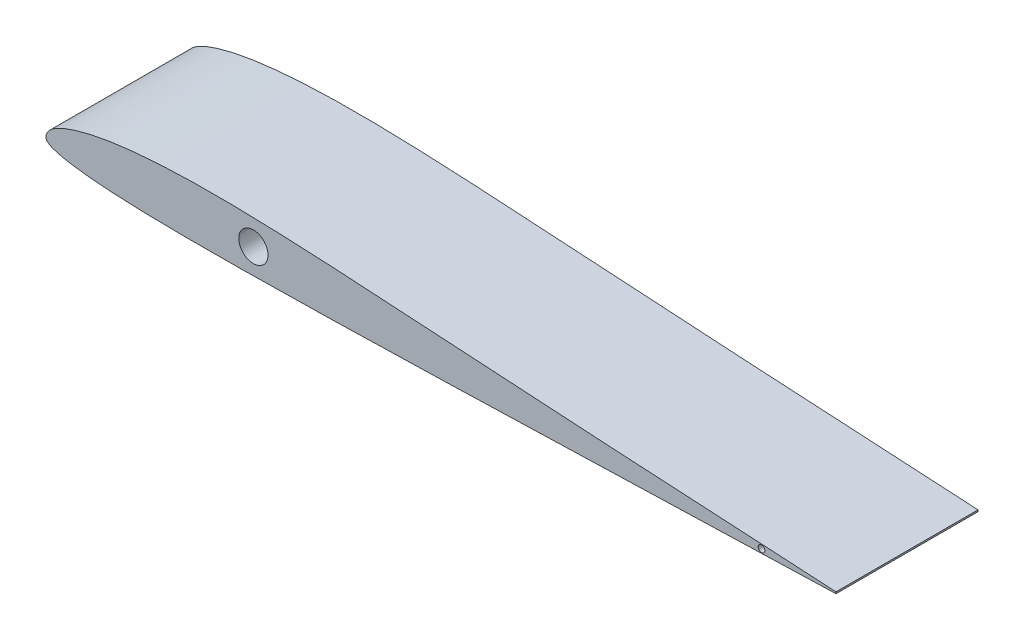
ISO-10303-21;
HEADER;
FILE_DESCRIPTION(('STEP AP214'),'2;1');
FILE_NAME('part.step','',(''),(''),'','','');
FILE_SCHEMA(('AUTOMOTIVE_DESIGN { 1 0 10303 214 1 1 1 1 }'));
ENDSEC;
DATA;
#1=APPLICATION_CONTEXT('core data for automotive mechanical design processes');
#2=APPLICATION_PROTOCOL_DEFINITION('international standard','automotive_design',2000,#1);
#3=PRODUCT_CONTEXT('',#1,'mechanical');
#4=PRODUCT('Part','Part','',(#3));
#5=PRODUCT_RELATED_PRODUCT_CATEGORY('part','',(#4));
#6=PRODUCT_DEFINITION_FORMATION('','',#4);
#7=PRODUCT_DEFINITION_CONTEXT('part definition',#1,'design');
#8=PRODUCT_DEFINITION('design','',#6,#7);
#9=PRODUCT_DEFINITION_SHAPE('','',#8);
#10=(LENGTH_UNIT() NAMED_UNIT(*) SI_UNIT(.MILLI.,.METRE.));
#11=(NAMED_UNIT(*) PLANE_ANGLE_UNIT() SI_UNIT($,.RADIAN.));
#12=(NAMED_UNIT(*) SI_UNIT($,.STERADIAN.) SOLID_ANGLE_UNIT());
#13=UNCERTAINTY_MEASURE_WITH_UNIT(LENGTH_MEASURE(1.E-05),#10,'distance_accuracy_value','');
#14=(GEOMETRIC_REPRESENTATION_CONTEXT(3) GLOBAL_UNCERTAINTY_ASSIGNED_CONTEXT((#13)) GLOBAL_UNIT_ASSIGNED_CONTEXT((#10,
#11,#12)) REPRESENTATION_CONTEXT('',''));
#15=CARTESIAN_POINT('',(0.,0.,0.));
#16=DIRECTION('',(0.,0.,1.));
#17=DIRECTION('',(1.,0.,0.));
#18=AXIS2_PLACEMENT_3D('',#15,#16,#17);
#19=CARTESIAN_POINT('',(203.2026416,0.2115312,36.5252));
#20=CARTESIAN_POINT('',(202.749975414214,0.235767734783693,36.5252));
#21=CARTESIAN_POINT('',(201.482227455129,0.303645165155392,36.5252));
#22=CARTESIAN_POINT('',(199.229899450745,0.427581861634507,36.5252));
#23=CARTESIAN_POINT('',(196.304631843074,0.586453569804522,36.5252));
#24=CARTESIAN_POINT('',(192.978703521501,0.769351744725375,36.5252));
#25=CARTESIAN_POINT('',(189.375038630984,0.970599062963847,36.5252));
#26=CARTESIAN_POINT('',(185.61293803716,1.17849842122764,36.5252));
#27=CARTESIAN_POINT('',(181.773697727003,1.39574279470324,36.5252));
#28=CARTESIAN_POINT('',(177.899622281438,1.61472768540946,36.5252));
#29=CARTESIAN_POINT('',(174.009999543543,1.83542086894183,36.5252));
#30=CARTESIAN_POINT('',(170.113241344583,2.05524887455833,36.5252));
#31=CARTESIAN_POINT('',(166.213278895906,2.27750571162191,36.5252));
#32=CARTESIAN_POINT('',(162.311711245859,2.49855094826848,36.5252));
#33=CARTESIAN_POINT('',(158.410741474799,2.72203959894091,36.5252));
#34=CARTESIAN_POINT('',(154.510593140347,2.94405035819366,36.5252));
#35=CARTESIAN_POINT('',(150.614228348647,3.16776581201688,36.5252));
#36=CARTESIAN_POINT('',(146.720449866501,3.39360624550566,36.5252));
#37=CARTESIAN_POINT('',(142.830938385283,3.61702165793931,36.5252));
#38=CARTESIAN_POINT('',(138.94403643726,3.84536221428733,36.5252));
#39=CARTESIAN_POINT('',(135.059465523439,4.07212095629104,36.5252));
#40=CARTESIAN_POINT('',(131.177542014113,4.30122424685328,36.5252));
#41=CARTESIAN_POINT('',(127.296716124729,4.53145723377412,36.5252));
#42=CARTESIAN_POINT('',(123.418858543701,4.76493565535851,36.5252));
#43=CARTESIAN_POINT('',(119.542057199406,5.0008038446031,36.5252));
#44=CARTESIAN_POINT('',(115.667451591807,5.23984544312267,36.5252));
#45=CARTESIAN_POINT('',(111.794903734423,5.48159071463948,36.5252));
#46=CARTESIAN_POINT('',(107.923563639658,5.72470066623811,36.5252));
#47=CARTESIAN_POINT('',(104.057153857125,5.96805571904665,36.5252));
#48=CARTESIAN_POINT('',(100.189436187725,6.21201947219739,36.5252));
#49=CARTESIAN_POINT('',(96.3187592253535,6.45429941451183,36.5252));
#50=CARTESIAN_POINT('',(92.4477469665437,6.69460507733827,36.5252));
#51=CARTESIAN_POINT('',(88.5840238230116,6.93215540156388,36.5252));
#52=CARTESIAN_POINT('',(84.7414608850474,7.16372568797598,36.5252));
#53=CARTESIAN_POINT('',(80.9229010977415,7.38892154234589,36.5252));
#54=CARTESIAN_POINT('',(77.3977822484607,7.59058237960871,36.5252));
#55=CARTESIAN_POINT('',(74.5229039738688,7.74928703910064,36.5252));
#56=CARTESIAN_POINT('',(71.9946178041055,7.88427640297458,36.5252));
#57=CARTESIAN_POINT('',(69.1241066986418,8.0323860035449,36.5252));
#58=CARTESIAN_POINT('',(65.5082685773936,8.20759336008406,36.5252));
#59=CARTESIAN_POINT('',(61.4852117617676,8.38313251402686,36.5252));
#60=CARTESIAN_POINT('',(57.5217690678555,8.53280676701247,36.5252));
#61=CARTESIAN_POINT('',(53.6733793096194,8.65196060951164,36.5252));
#62=CARTESIAN_POINT('',(49.9058290135962,8.73901945708644,36.5252));
#63=CARTESIAN_POINT('',(46.1809606092667,8.79124550494574,36.5252));
#64=CARTESIAN_POINT('',(42.4909645320681,8.80473096014535,36.5252));
#65=CARTESIAN_POINT('',(38.8468004873091,8.77422037238229,36.5252));
#66=CARTESIAN_POINT('',(35.2596299741743,8.69620333219658,36.5252));
#67=CARTESIAN_POINT('',(31.7560764726491,8.567101257322,36.5252));
#68=CARTESIAN_POINT('',(28.3660630730211,8.38563704679244,36.5252));
#69=CARTESIAN_POINT('',(25.1291651199612,8.15198593348535,36.5252));
#70=CARTESIAN_POINT('',(22.0797800024549,7.86875133887376,36.5252));
#71=CARTESIAN_POINT('',(19.2587287770041,7.54280933002275,36.5252));
#72=CARTESIAN_POINT('',(16.7018844782888,7.18368954419313,36.5252));
#73=CARTESIAN_POINT('',(14.4336298153729,6.80580187322694,36.5252));
#74=CARTESIAN_POINT('',(12.4540920416861,6.42155969251117,36.5252));
#75=CARTESIAN_POINT('',(10.7471227968937,6.04182029500315,36.5252));
#76=CARTESIAN_POINT('',(9.28297955630773,5.67405272470323,36.5252));
#77=CARTESIAN_POINT('',(8.02638098124664,5.32164066980515,36.5252));
#78=CARTESIAN_POINT('',(6.93936486067689,4.9843770423618,36.5252));
#79=CARTESIAN_POINT('',(5.98759748872026,4.6598873075416,36.5252));
#80=CARTESIAN_POINT('',(5.1428725649252,4.34265889049886,36.5252));
#81=CARTESIAN_POINT('',(4.37538975407757,4.03010908811877,36.5252));
#82=CARTESIAN_POINT('',(3.65774437525309,3.70806316387592,36.5252));
#83=CARTESIAN_POINT('',(2.96460755408096,3.36068378579662,36.5252));
#84=CARTESIAN_POINT('',(2.28675214136728,2.97080063882906,36.5252));
#85=CARTESIAN_POINT('',(1.63836125714743,2.53049626981969,36.5252));
#86=CARTESIAN_POINT('',(1.04996246614265,2.03551843765855,36.5252));
#87=CARTESIAN_POINT('',(0.551053420241179,1.4823042710973,36.5252));
#88=CARTESIAN_POINT('',(0.182124171420684,0.879494893293436,36.5252));
#89=CARTESIAN_POINT('',(0.0202267637935078,0.365089230709945,36.5252));
#90=CARTESIAN_POINT('',(-0.00647865788723579,-0.0192978009153292,36.5252));
#91=CARTESIAN_POINT('',(0.01939357767937,-0.313623078027107,36.5252));
#92=CARTESIAN_POINT('',(0.126773921416148,-0.614429835454027,36.5252));
#93=CARTESIAN_POINT('',(0.296985654104803,-0.854594391155066,36.5252));
#94=CARTESIAN_POINT('',(0.474203046042865,-1.03604179960822,36.5252));
#95=CARTESIAN_POINT('',(0.692231826741156,-1.20544842808995,36.5252));
#96=CARTESIAN_POINT('',(0.984641636012227,-1.38481229993686,36.5252));
#97=CARTESIAN_POINT('',(1.35247345058695,-1.56684048587371,36.5252));
#98=CARTESIAN_POINT('',(1.77937947279749,-1.74480110377818,36.5252));
#99=CARTESIAN_POINT('',(2.26050040728367,-1.91716904680297,36.5252));
#100=CARTESIAN_POINT('',(2.80666484896907,-2.08758304631129,36.5252));
#101=CARTESIAN_POINT('',(3.44133281433502,-2.26016455173235,36.5252));
#102=CARTESIAN_POINT('',(4.18811536120561,-2.43800498173381,36.5252));
#103=CARTESIAN_POINT('',(5.06690205992957,-2.62153213625799,36.5252));
#104=CARTESIAN_POINT('',(6.09215778919466,-2.80686191112917,36.5252));
#105=CARTESIAN_POINT('',(7.27657108465582,-2.99305990234064,36.5252));
#106=CARTESIAN_POINT('',(8.63433450808288,-3.17800005050488,36.5252));
#107=CARTESIAN_POINT('',(10.1868784327678,-3.35940407970436,36.5252));
#108=CARTESIAN_POINT('',(11.9608204024851,-3.53689409852664,36.5252));
#109=CARTESIAN_POINT('',(13.9882488909721,-3.70766441767832,36.5252));
#110=CARTESIAN_POINT('',(16.2949286820058,-3.86890443637265,36.5252));
#111=CARTESIAN_POINT('',(18.8937299595197,-4.01552860631397,36.5252));
#112=CARTESIAN_POINT('',(21.7661544856954,-4.14367946142993,36.5252));
#113=CARTESIAN_POINT('',(24.8729300701607,-4.24924479500108,36.5252));
#114=CARTESIAN_POINT('',(28.1584358390547,-4.32974271781794,36.5252));
#115=CARTESIAN_POINT('',(31.5774599251836,-4.38668167368653,36.5252));
#116=CARTESIAN_POINT('',(35.091351007061,-4.42065067261385,36.5252));
#117=CARTESIAN_POINT('',(38.6791065051459,-4.43511802947522,36.5252));
#118=CARTESIAN_POINT('',(42.3216384433834,-4.43112733188236,36.5252));
#119=CARTESIAN_POINT('',(46.0125864059316,-4.41245393190401,36.5252));
#120=CARTESIAN_POINT('',(49.7579011662747,-4.37953330748457,36.5252));
#121=CARTESIAN_POINT('',(53.580508995374,-4.3371795167898,36.5252));
#122=CARTESIAN_POINT('',(57.51494368277,-4.28420063094793,36.5252));
#123=CARTESIAN_POINT('',(61.595949926973,-4.22022430117123,36.5252));
#124=CARTESIAN_POINT('',(65.8840869032483,-4.14446159132681,36.5252));
#125=CARTESIAN_POINT('',(69.5839892812841,-4.07209558569885,36.5252));
#126=CARTESIAN_POINT('',(72.8088205052961,-4.00504315467108,36.5252));
#127=CARTESIAN_POINT('',(75.579862856659,-3.94475428809816,36.5252));
#128=CARTESIAN_POINT('',(78.770794894052,-3.87272283980522,36.5252));
#129=CARTESIAN_POINT('',(82.2137450439877,-3.79089859123467,36.5252));
#130=CARTESIAN_POINT('',(85.8122785085194,-3.70205704498826,36.5252));
#131=CARTESIAN_POINT('',(89.4547756822337,-3.60914149373997,36.5252));
#132=CARTESIAN_POINT('',(93.1502273174683,-3.51161657299529,36.5252));
#133=CARTESIAN_POINT('',(96.888909493849,-3.41106963697368,36.5252));
#134=CARTESIAN_POINT('',(100.657029943945,-3.30688605174212,36.5252));
#135=CARTESIAN_POINT('',(104.439744756363,-3.20175658151176,36.5252));
#136=CARTESIAN_POINT('',(108.224810971309,-3.09451440152326,36.5252));
#137=CARTESIAN_POINT('',(112.008194618499,-2.98630114435506,36.5252));
#138=CARTESIAN_POINT('',(115.791031648668,-2.87663597937443,36.5252));
#139=CARTESIAN_POINT('',(119.57821764888,-2.76581839637284,36.5252));
#140=CARTESIAN_POINT('',(123.37648398673,-2.65229882992738,36.5252));
#141=CARTESIAN_POINT('',(127.194486091766,-2.53759881587095,36.5252));
#142=CARTESIAN_POINT('',(131.041647040333,-2.42001208941009,36.5252));
#143=CARTESIAN_POINT('',(134.919802338857,-2.30198944056524,36.5252));
#144=CARTESIAN_POINT('',(138.819361759731,-2.18233827100523,36.5252));
#145=CARTESIAN_POINT('',(142.726333167936,-2.06015623596751,36.5252));
#146=CARTESIAN_POINT('',(146.633431623971,-1.93730642872805,36.5252));
#147=CARTESIAN_POINT('',(150.540542811073,-1.81690059962873,36.5252));
#148=CARTESIAN_POINT('',(154.447614149166,-1.69351637436054,36.5252));
#149=CARTESIAN_POINT('',(158.354722860532,-1.57350913402701,36.5252));
#150=CARTESIAN_POINT('',(162.261482060008,-1.45151423862463,36.5252));
#151=CARTESIAN_POINT('',(166.167503922585,-1.33168152694398,36.5252));
#152=CARTESIAN_POINT('',(170.071797885411,-1.2088888369474,36.5252));
#153=CARTESIAN_POINT('',(173.972889130846,-1.08970992999081,36.5252));
#154=CARTESIAN_POINT('',(177.866894682228,-0.967751166869341,36.5252));
#155=CARTESIAN_POINT('',(181.745322490018,-0.848820182751895,36.5252));
#156=CARTESIAN_POINT('',(185.588910115564,-0.731171396447741,36.5252));
#157=CARTESIAN_POINT('',(189.354936456954,-0.616949476960081,36.5252));
#158=CARTESIAN_POINT('',(192.962622683528,-0.509627046893688,36.5252));
#159=CARTESIAN_POINT('',(196.29203641017,-0.412964276205574,36.5252));
#160=CARTESIAN_POINT('',(199.220341745234,-0.32481888943822,36.5252));
#161=CARTESIAN_POINT('',(201.475188064471,-0.261715668448918,36.5252));
#162=CARTESIAN_POINT('',(202.744291930109,-0.224733668707332,36.5252));
#163=CARTESIAN_POINT('',(203.1973584,-0.2115312,36.5252));
#164=B_SPLINE_CURVE_WITH_KNOTS('',3,(#19,#20,#21,#22,#23,#24,#25,#26,#27,#28,#29,#30,#31,#32,
#33,#34,#35,#36,#37,#38,#39,#40,#41,#42,#43,#44,#45,#46,#47,#48,#49,#50,#51,#52,#53,#54,#55,#56,
#57,#58,#59,#60,#61,#62,#63,#64,#65,#66,#67,#68,#69,#70,#71,#72,#73,#74,#75,#76,#77,#78,#79,#80,
#81,#82,#83,#84,#85,#86,#87,#88,#89,#90,#91,#92,#93,#94,#95,#96,#97,#98,#99,#100,#101,#102,#103,
#104,#105,#106,#107,#108,#109,#110,#111,#112,#113,#114,#115,#116,#117,#118,#119,#120,#121,#122,
#123,#124,#125,#126,#127,#128,#129,#130,#131,#132,#133,#134,#135,#136,#137,#138,#139,#140,#141,
#142,#143,#144,#145,#146,#147,#148,#149,#150,#151,#152,#153,#154,#155,#156,#157,#158,#159,#160,
#161,#162,#163),.UNSPECIFIED.,.F.,.F.,(4,1,1,1,1,1,1,1,1,1,1,1,1,1,1,1,1,1,1,1,1,1,1,1,1,1,1,1,
1,1,1,1,1,1,1,1,1,1,1,1,1,1,1,1,1,1,1,1,1,1,1,1,1,1,1,1,1,1,1,1,1,1,1,1,1,1,1,1,1,1,1,1,1,1,1,1,
1,1,1,1,1,1,1,1,1,1,1,1,1,1,1,1,1,1,1,1,1,1,1,1,1,1,1,1,1,1,1,1,1,1,1,1,1,1,1,1,1,1,1,1,1,1,1,1,
1,1,1,1,1,1,1,1,1,1,1,1,1,1,1,1,1,1,4),(0.,0.00331578266893232,0.00928626180461971,
0.016499639572349,0.0247442742863147,0.0336506176497757,0.0428998255449531,0.0523042543398623,
0.0617777745871433,0.0712821028680933,0.080800775873043,0.0903260475165949,0.0998547816364509,
0.1093846741043,0.118906595978718,0.1284287160728,0.13793168860118,0.147435621775591,
0.15692555634894,0.166411563124198,0.175897802365091,0.185369409371828,0.194847889154316,
0.204313870249986,0.213778822338608,0.223242689649021,0.232694875272755,0.242151635360248,
0.251579623462007,0.261041636451824,0.270519226185692,0.279948764353158,0.289356316207907,
0.298676753847248,0.307928254076232,0.315183044126044,0.319737140130964,0.326447814006928,
0.336207398216209,0.346216249033922,0.355902440394501,0.365218590590601,0.374378655178627,
0.383467329810455,0.392466507486125,0.401368859881799,0.410122896153213,0.418710298619283,
0.427012022459878,0.434953476417025,0.442446764106595,0.449411133570765,0.455723479066676,
0.461330458728241,0.466229103364203,0.47047132371911,0.4741197856208,0.477269945540835,
0.480016169780143,0.482443707006526,0.484624060392398,0.486615379248408,0.488504220183979,
0.49037624489398,0.492284157312094,0.494220158545674,0.496101738371251,0.49789553013663,
0.499645689489734,0.501236957338147,0.501776183658006,0.502456995561786,0.503385549745094,
0.504071488121517,0.50459527898751,0.505236101121174,0.506085552390854,0.507100328876505,
0.508234963524288,0.509466926150983,0.510837230086885,0.512418823840573,0.514276845623736,
0.516451552023844,0.518984587721624,0.52189683160757,0.525220722895112,0.529007030898599,
0.533329617127375,0.538260506577518,0.54388867304795,0.550242528384664,0.557299236011427,
0.564919575683094,0.572979856920856,0.581338081244914,0.58993137194436,0.598683350285127,
0.607580916055957,0.616574706175694,0.625681179810954,0.634977149577477,0.644536982117726,
0.654462302363915,0.664831439422966,0.675907565205131,0.681530510409257,0.688424660844691,
0.696181231828246,0.704876621280378,0.713615328831594,0.72251083123188,0.731528439944248,
0.74065523049799,0.749867420562749,0.759101002307153,0.768334695275075,0.777564510897951,
0.786785993138317,0.79601599527679,0.80527785261822,0.81458093151181,0.823955485665527,
0.833431167811627,0.8429609486494,0.852492353120074,0.862022798155571,0.871553661188471,
0.881084601418823,0.890615433752846,0.900145801586878,0.909674637805171,0.919199589274313,
0.928717995689192,0.938222597811679,0.947696374978426,0.957100206788536,0.966349802798322,
0.975255754457463,0.983500407749064,0.990713161259302,0.996684624987268,1.),.UNSPECIFIED.);
#165=DIRECTION('',(0.,0.,-1.));
#166=VECTOR('',#165,1.);
#167=SURFACE_OF_LINEAR_EXTRUSION('',#164,#166);
#168=CARTESIAN_POINT('',(203.2026416,0.2115312,0.));
#169=CARTESIAN_POINT('',(202.749975414214,0.235767734783693,0.));
#170=CARTESIAN_POINT('',(201.482227455129,0.303645165155392,0.));
#171=CARTESIAN_POINT('',(199.229899450745,0.427581861634507,0.));
#172=CARTESIAN_POINT('',(196.304631843074,0.586453569804522,0.));
#173=CARTESIAN_POINT('',(192.978703521501,0.769351744725375,0.));
#174=CARTESIAN_POINT('',(189.375038630984,0.970599062963847,0.));
#175=CARTESIAN_POINT('',(185.61293803716,1.17849842122764,0.));
#176=CARTESIAN_POINT('',(181.773697727003,1.39574279470324,0.));
#177=CARTESIAN_POINT('',(177.899622281438,1.61472768540946,0.));
#178=CARTESIAN_POINT('',(174.009999543543,1.83542086894183,0.));
#179=CARTESIAN_POINT('',(170.113241344583,2.05524887455833,0.));
#180=CARTESIAN_POINT('',(166.213278895906,2.27750571162191,0.));
#181=CARTESIAN_POINT('',(162.311711245859,2.49855094826848,0.));
#182=CARTESIAN_POINT('',(158.410741474799,2.72203959894091,0.));
#183=CARTESIAN_POINT('',(154.510593140347,2.94405035819366,0.));
#184=CARTESIAN_POINT('',(150.614228348647,3.16776581201688,0.));
#185=CARTESIAN_POINT('',(146.720449866501,3.39360624550566,0.));
#186=CARTESIAN_POINT('',(142.830938385283,3.61702165793931,0.));
#187=CARTESIAN_POINT('',(138.94403643726,3.84536221428733,0.));
#188=CARTESIAN_POINT('',(135.059465523439,4.07212095629104,0.));
#189=CARTESIAN_POINT('',(131.177542014113,4.30122424685328,0.));
#190=CARTESIAN_POINT('',(127.296716124729,4.53145723377412,0.));
#191=CARTESIAN_POINT('',(123.418858543701,4.76493565535851,0.));
#192=CARTESIAN_POINT('',(119.542057199406,5.0008038446031,0.));
#193=CARTESIAN_POINT('',(115.667451591807,5.23984544312267,0.));
#194=CARTESIAN_POINT('',(111.794903734423,5.48159071463948,0.));
#195=CARTESIAN_POINT('',(107.923563639658,5.72470066623811,0.));
#196=CARTESIAN_POINT('',(104.057153857125,5.96805571904665,0.));
#197=CARTESIAN_POINT('',(100.189436187725,6.21201947219739,0.));
#198=CARTESIAN_POINT('',(96.3187592253535,6.45429941451183,0.));
#199=CARTESIAN_POINT('',(92.4477469665437,6.69460507733827,0.));
#200=CARTESIAN_POINT('',(88.5840238230116,6.93215540156388,0.));
#201=CARTESIAN_POINT('',(84.7414608850474,7.16372568797598,0.));
#202=CARTESIAN_POINT('',(80.9229010977415,7.38892154234589,0.));
#203=CARTESIAN_POINT('',(77.3977822484607,7.59058237960871,0.));
#204=CARTESIAN_POINT('',(74.5229039738688,7.74928703910064,0.));
#205=CARTESIAN_POINT('',(71.9946178041055,7.88427640297458,0.));
#206=CARTESIAN_POINT('',(69.1241066986418,8.0323860035449,0.));
#207=CARTESIAN_POINT('',(65.5082685773936,8.20759336008406,0.));
#208=CARTESIAN_POINT('',(61.4852117617676,8.38313251402686,0.));
#209=CARTESIAN_POINT('',(57.5217690678555,8.53280676701247,0.));
#210=CARTESIAN_POINT('',(53.6733793096194,8.65196060951164,0.));
#211=CARTESIAN_POINT('',(49.9058290135962,8.73901945708644,0.));
#212=CARTESIAN_POINT('',(46.1809606092667,8.79124550494574,0.));
#213=CARTESIAN_POINT('',(42.4909645320681,8.80473096014535,0.));
#214=CARTESIAN_POINT('',(38.8468004873091,8.77422037238229,0.));
#215=CARTESIAN_POINT('',(35.2596299741743,8.69620333219658,0.));
#216=CARTESIAN_POINT('',(31.7560764726491,8.567101257322,0.));
#217=CARTESIAN_POINT('',(28.3660630730211,8.38563704679244,0.));
#218=CARTESIAN_POINT('',(25.1291651199612,8.15198593348535,0.));
#219=CARTESIAN_POINT('',(22.0797800024549,7.86875133887376,0.));
#220=CARTESIAN_POINT('',(19.2587287770041,7.54280933002275,0.));
#221=CARTESIAN_POINT('',(16.7018844782888,7.18368954419313,0.));
#222=CARTESIAN_POINT('',(14.4336298153729,6.80580187322694,0.));
#223=CARTESIAN_POINT('',(12.4540920416861,6.42155969251117,0.));
#224=CARTESIAN_POINT('',(10.7471227968937,6.04182029500315,0.));
#225=CARTESIAN_POINT('',(9.28297955630773,5.67405272470323,0.));
#226=CARTESIAN_POINT('',(8.02638098124664,5.32164066980515,0.));
#227=CARTESIAN_POINT('',(6.93936486067689,4.9843770423618,0.));
#228=CARTESIAN_POINT('',(5.98759748872026,4.6598873075416,0.));
#229=CARTESIAN_POINT('',(5.1428725649252,4.34265889049886,0.));
#230=CARTESIAN_POINT('',(4.37538975407757,4.03010908811877,0.));
#231=CARTESIAN_POINT('',(3.65774437525309,3.70806316387592,0.));
#232=CARTESIAN_POINT('',(2.96460755408096,3.36068378579662,0.));
#233=CARTESIAN_POINT('',(2.28675214136728,2.97080063882906,0.));
#234=CARTESIAN_POINT('',(1.63836125714743,2.53049626981969,0.));
#235=CARTESIAN_POINT('',(1.04996246614265,2.03551843765855,0.));
#236=CARTESIAN_POINT('',(0.551053420241179,1.4823042710973,0.));
#237=CARTESIAN_POINT('',(0.182124171420684,0.879494893293436,0.));
#238=CARTESIAN_POINT('',(0.0202267637935078,0.365089230709945,0.));
#239=CARTESIAN_POINT('',(-0.00647865788723579,-0.0192978009153292,0.));
#240=CARTESIAN_POINT('',(0.01939357767937,-0.313623078027107,0.));
#241=CARTESIAN_POINT('',(0.126773921416148,-0.614429835454027,0.));
#242=CARTESIAN_POINT('',(0.296985654104803,-0.854594391155066,0.));
#243=CARTESIAN_POINT('',(0.474203046042865,-1.03604179960822,0.));
#244=CARTESIAN_POINT('',(0.692231826741156,-1.20544842808995,0.));
#245=CARTESIAN_POINT('',(0.984641636012227,-1.38481229993686,0.));
#246=CARTESIAN_POINT('',(1.35247345058695,-1.56684048587371,0.));
#247=CARTESIAN_POINT('',(1.77937947279749,-1.74480110377818,0.));
#248=CARTESIAN_POINT('',(2.26050040728367,-1.91716904680297,0.));
#249=CARTESIAN_POINT('',(2.80666484896907,-2.08758304631129,0.));
#250=CARTESIAN_POINT('',(3.44133281433502,-2.26016455173235,0.));
#251=CARTESIAN_POINT('',(4.18811536120561,-2.43800498173381,0.));
#252=CARTESIAN_POINT('',(5.06690205992957,-2.62153213625799,0.));
#253=CARTESIAN_POINT('',(6.09215778919466,-2.80686191112917,0.));
#254=CARTESIAN_POINT('',(7.27657108465582,-2.99305990234064,0.));
#255=CARTESIAN_POINT('',(8.63433450808288,-3.17800005050488,0.));
#256=CARTESIAN_POINT('',(10.1868784327678,-3.35940407970436,0.));
#257=CARTESIAN_POINT('',(11.9608204024851,-3.53689409852664,0.));
#258=CARTESIAN_POINT('',(13.9882488909721,-3.70766441767832,0.));
#259=CARTESIAN_POINT('',(16.2949286820058,-3.86890443637265,0.));
#260=CARTESIAN_POINT('',(18.8937299595197,-4.01552860631397,0.));
#261=CARTESIAN_POINT('',(21.7661544856954,-4.14367946142993,0.));
#262=CARTESIAN_POINT('',(24.8729300701607,-4.24924479500108,0.));
#263=CARTESIAN_POINT('',(28.1584358390547,-4.32974271781794,0.));
#264=CARTESIAN_POINT('',(31.5774599251836,-4.38668167368653,0.));
#265=CARTESIAN_POINT('',(35.091351007061,-4.42065067261385,0.));
#266=CARTESIAN_POINT('',(38.6791065051459,-4.43511802947522,0.));
#267=CARTESIAN_POINT('',(42.3216384433834,-4.43112733188236,0.));
#268=CARTESIAN_POINT('',(46.0125864059316,-4.41245393190401,0.));
#269=CARTESIAN_POINT('',(49.7579011662747,-4.37953330748457,0.));
#270=CARTESIAN_POINT('',(53.580508995374,-4.3371795167898,0.));
#271=CARTESIAN_POINT('',(57.51494368277,-4.28420063094793,0.));
#272=CARTESIAN_POINT('',(61.595949926973,-4.22022430117123,0.));
#273=CARTESIAN_POINT('',(65.8840869032483,-4.14446159132681,0.));
#274=CARTESIAN_POINT('',(69.5839892812841,-4.07209558569885,0.));
#275=CARTESIAN_POINT('',(72.8088205052961,-4.00504315467108,0.));
#276=CARTESIAN_POINT('',(75.579862856659,-3.94475428809816,0.));
#277=CARTESIAN_POINT('',(78.770794894052,-3.87272283980522,0.));
#278=CARTESIAN_POINT('',(82.2137450439877,-3.79089859123467,0.));
#279=CARTESIAN_POINT('',(85.8122785085194,-3.70205704498826,0.));
#280=CARTESIAN_POINT('',(89.4547756822337,-3.60914149373997,0.));
#281=CARTESIAN_POINT('',(93.1502273174683,-3.51161657299529,0.));
#282=CARTESIAN_POINT('',(96.888909493849,-3.41106963697368,0.));
#283=CARTESIAN_POINT('',(100.657029943945,-3.30688605174212,0.));
#284=CARTESIAN_POINT('',(104.439744756363,-3.20175658151176,0.));
#285=CARTESIAN_POINT('',(108.224810971309,-3.09451440152326,0.));
#286=CARTESIAN_POINT('',(112.008194618499,-2.98630114435506,0.));
#287=CARTESIAN_POINT('',(115.791031648668,-2.87663597937443,0.));
#288=CARTESIAN_POINT('',(119.57821764888,-2.76581839637284,0.));
#289=CARTESIAN_POINT('',(123.37648398673,-2.65229882992738,0.));
#290=CARTESIAN_POINT('',(127.194486091766,-2.53759881587095,0.));
#291=CARTESIAN_POINT('',(131.041647040333,-2.42001208941009,0.));
#292=CARTESIAN_POINT('',(134.919802338857,-2.30198944056524,0.));
#293=CARTESIAN_POINT('',(138.819361759731,-2.18233827100523,0.));
#294=CARTESIAN_POINT('',(142.726333167936,-2.06015623596751,0.));
#295=CARTESIAN_POINT('',(146.633431623971,-1.93730642872805,0.));
#296=CARTESIAN_POINT('',(150.540542811073,-1.81690059962873,0.));
#297=CARTESIAN_POINT('',(154.447614149166,-1.69351637436054,0.));
#298=CARTESIAN_POINT('',(158.354722860532,-1.57350913402701,0.));
#299=CARTESIAN_POINT('',(162.261482060008,-1.45151423862463,0.));
#300=CARTESIAN_POINT('',(166.167503922585,-1.33168152694398,0.));
#301=CARTESIAN_POINT('',(170.071797885411,-1.2088888369474,0.));
#302=CARTESIAN_POINT('',(173.972889130846,-1.08970992999081,0.));
#303=CARTESIAN_POINT('',(177.866894682228,-0.967751166869341,0.));
#304=CARTESIAN_POINT('',(181.745322490018,-0.848820182751895,0.));
#305=CARTESIAN_POINT('',(185.588910115564,-0.731171396447741,0.));
#306=CARTESIAN_POINT('',(189.354936456954,-0.616949476960081,0.));
#307=CARTESIAN_POINT('',(192.962622683528,-0.509627046893688,0.));
#308=CARTESIAN_POINT('',(196.29203641017,-0.412964276205574,0.));
#309=CARTESIAN_POINT('',(199.220341745234,-0.32481888943822,0.));
#310=CARTESIAN_POINT('',(201.475188064471,-0.261715668448918,0.));
#311=CARTESIAN_POINT('',(202.744291930109,-0.224733668707332,0.));
#312=CARTESIAN_POINT('',(203.1973584,-0.2115312,0.));
#313=B_SPLINE_CURVE_WITH_KNOTS('',3,(#168,#169,#170,#171,#172,#173,#174,#175,#176,#177,#178,
#179,#180,#181,#182,#183,#184,#185,#186,#187,#188,#189,#190,#191,#192,#193,#194,#195,#196,#197,
#198,#199,#200,#201,#202,#203,#204,#205,#206,#207,#208,#209,#210,#211,#212,#213,#214,#215,#216,
#217,#218,#219,#220,#221,#222,#223,#224,#225,#226,#227,#228,#229,#230,#231,#232,#233,#234,#235,
#236,#237,#238,#239,#240,#241,#242,#243,#244,#245,#246,#247,#248,#249,#250,#251,#252,#253,#254,
#255,#256,#257,#258,#259,#260,#261,#262,#263,#264,#265,#266,#267,#268,#269,#270,#271,#272,#273,
#274,#275,#276,#277,#278,#279,#280,#281,#282,#283,#284,#285,#286,#287,#288,#289,#290,#291,#292,
#293,#294,#295,#296,#297,#298,#299,#300,#301,#302,#303,#304,#305,#306,#307,#308,#309,#310,#311,
#312),.UNSPECIFIED.,.F.,.F.,(4,1,1,1,1,1,1,1,1,1,1,1,1,1,1,1,1,1,1,1,1,1,1,1,1,1,1,1,1,1,1,1,1,
1,1,1,1,1,1,1,1,1,1,1,1,1,1,1,1,1,1,1,1,1,1,1,1,1,1,1,1,1,1,1,1,1,1,1,1,1,1,1,1,1,1,1,1,1,1,1,1,
1,1,1,1,1,1,1,1,1,1,1,1,1,1,1,1,1,1,1,1,1,1,1,1,1,1,1,1,1,1,1,1,1,1,1,1,1,1,1,1,1,1,1,1,1,1,1,1,
1,1,1,1,1,1,1,1,1,1,1,1,1,4),(0.,0.00331578266893232,0.00928626180461971,0.016499639572349,
0.0247442742863147,0.0336506176497757,0.0428998255449531,0.0523042543398623,0.0617777745871433,
0.0712821028680933,0.080800775873043,0.0903260475165949,0.0998547816364509,0.1093846741043,
0.118906595978718,0.1284287160728,0.13793168860118,0.147435621775591,0.15692555634894,
0.166411563124198,0.175897802365091,0.185369409371828,0.194847889154316,0.204313870249986,
0.213778822338608,0.223242689649021,0.232694875272755,0.242151635360248,0.251579623462007,
0.261041636451824,0.270519226185692,0.279948764353158,0.289356316207907,0.298676753847248,
0.307928254076232,0.315183044126044,0.319737140130964,0.326447814006928,0.336207398216209,
0.346216249033922,0.355902440394501,0.365218590590601,0.374378655178627,0.383467329810455,
0.392466507486125,0.401368859881799,0.410122896153213,0.418710298619283,0.427012022459878,
0.434953476417025,0.442446764106595,0.449411133570765,0.455723479066676,0.461330458728241,
0.466229103364203,0.47047132371911,0.4741197856208,0.477269945540835,0.480016169780143,
0.482443707006526,0.484624060392398,0.486615379248408,0.488504220183979,0.49037624489398,
0.492284157312094,0.494220158545674,0.496101738371251,0.49789553013663,0.499645689489734,
0.501236957338147,0.501776183658006,0.502456995561786,0.503385549745094,0.504071488121517,
0.50459527898751,0.505236101121174,0.506085552390854,0.507100328876505,0.508234963524288,
0.509466926150983,0.510837230086885,0.512418823840573,0.514276845623736,0.516451552023844,
0.518984587721624,0.52189683160757,0.525220722895112,0.529007030898599,0.533329617127375,
0.538260506577518,0.54388867304795,0.550242528384664,0.557299236011427,0.564919575683094,
0.572979856920856,0.581338081244914,0.58993137194436,0.598683350285127,0.607580916055957,
0.616574706175694,0.625681179810954,0.634977149577477,0.644536982117726,0.654462302363915,
0.664831439422966,0.675907565205131,0.681530510409257,0.688424660844691,0.696181231828246,
0.704876621280378,0.713615328831594,0.72251083123188,0.731528439944248,0.74065523049799,
0.749867420562749,0.759101002307153,0.768334695275075,0.777564510897951,0.786785993138317,
0.79601599527679,0.80527785261822,0.81458093151181,0.823955485665527,0.833431167811627,
0.8429609486494,0.852492353120074,0.862022798155571,0.871553661188471,0.881084601418823,
0.890615433752846,0.900145801586878,0.909674637805171,0.919199589274313,0.928717995689192,
0.938222597811679,0.947696374978426,0.957100206788536,0.966349802798322,0.975255754457463,
0.983500407749064,0.990713161259302,0.996684624987268,1.),.UNSPECIFIED.);
#314=CARTESIAN_POINT('',(203.2026416,0.2115312,0.));
#315=VERTEX_POINT('',#314);
#316=CARTESIAN_POINT('',(203.1973584,-0.2115312,0.));
#317=VERTEX_POINT('',#316);
#318=EDGE_CURVE('E67',#315,#317,#313,.T.);
#319=ORIENTED_EDGE('',*,*,#318,.T.);
#320=DIRECTION('',(0.,0.,-1.));
#321=VECTOR('',#320,1.);
#322=CARTESIAN_POINT('',(203.1973584,-0.2115312,36.5252));
#323=LINE('',#322,#321);
#324=CARTESIAN_POINT('',(203.1973584,-0.2115312,36.5252));
#325=VERTEX_POINT('',#324);
#326=EDGE_CURVE('E11',#325,#317,#323,.T.);
#327=ORIENTED_EDGE('',*,*,#326,.F.);
#328=CARTESIAN_POINT('',(203.2026416,0.2115312,36.5252));
#329=VERTEX_POINT('',#328);
#330=EDGE_CURVE('E66',#329,#325,#164,.T.);
#331=ORIENTED_EDGE('',*,*,#330,.F.);
#332=DIRECTION('',(0.,0.,-1.));
#333=VECTOR('',#332,1.);
#334=CARTESIAN_POINT('',(203.2026416,0.2115312,36.5252));
#335=LINE('',#334,#333);
#336=EDGE_CURVE('E44',#329,#315,#335,.T.);
#337=ORIENTED_EDGE('',*,*,#336,.T.);
#338=EDGE_LOOP('',(#319,#327,#331,#337));
#339=FACE_BOUND('',#338,.T.);
#340=ADVANCED_FACE('F35',(#339),#167,.F.);
#341=CARTESIAN_POINT('',(203.2026416,0.2115312,36.5252));
#342=DIRECTION('',(-0.999922034142928,0.0124870186782158,0.));
#343=DIRECTION('',(-0.0124870186782158,-0.999922034142928,0.));
#344=AXIS2_PLACEMENT_3D('',#341,#342,#343);
#345=PLANE('',#344);
#346=DIRECTION('',(0.0124870186782158,0.999922034142927,0.));
#347=VECTOR('',#346,1.);
#348=CARTESIAN_POINT('',(203.2026416,0.2115312,0.));
#349=LINE('',#348,#347);
#350=EDGE_CURVE('E59',#317,#315,#349,.T.);
#351=ORIENTED_EDGE('',*,*,#350,.T.);
#352=ORIENTED_EDGE('',*,*,#336,.F.);
#353=DIRECTION('',(0.0124870186782158,0.999922034142927,0.));
#354=VECTOR('',#353,1.);
#355=CARTESIAN_POINT('',(203.2026416,0.2115312,36.5252));
#356=LINE('',#355,#354);
#357=EDGE_CURVE('E51',#325,#329,#356,.T.);
#358=ORIENTED_EDGE('',*,*,#357,.F.);
#359=ORIENTED_EDGE('',*,*,#326,.T.);
#360=EDGE_LOOP('',(#351,#352,#358,#359));
#361=FACE_BOUND('',#360,.T.);
#362=ADVANCED_FACE('F62',(#361),#345,.F.);
#363=CARTESIAN_POINT('',(0.14229609762251,0.712080157773631,36.5252));
#364=DIRECTION('',(0.,0.,1.));
#365=DIRECTION('',(1.,0.,0.));
#366=AXIS2_PLACEMENT_3D('',#363,#364,#365);
#367=PLANE('',#366);
#368=CARTESIAN_POINT('',(184.0510416,0.244383132665084,36.5252));
#369=DIRECTION('',(0.,0.,-1.));
#370=DIRECTION('',(-1.,0.,0.));
#371=AXIS2_PLACEMENT_3D('',#368,#369,#370);
#372=CIRCLE('',#371,0.863599999999986);
#373=CARTESIAN_POINT('',(183.1874416,0.244383132665084,36.5252));
#374=VERTEX_POINT('',#373);
#375=EDGE_CURVE('E90',#374,#374,#372,.T.);
#376=ORIENTED_EDGE('',*,*,#375,.T.);
#377=EDGE_LOOP('',(#376));
#378=FACE_BOUND('',#377,.T.);
#379=CARTESIAN_POINT('',(53.3399999809268,2.15866288958434,36.5252));
#380=DIRECTION('',(0.,0.,1.));
#381=DIRECTION('',(1.,0.,0.));
#382=AXIS2_PLACEMENT_3D('',#379,#380,#381);
#383=CIRCLE('',#382,3.75919999999999);
#384=CARTESIAN_POINT('',(57.0991999809268,2.15866288958434,36.5252));
#385=VERTEX_POINT('',#384);
#386=EDGE_CURVE('E74',#385,#385,#383,.F.);
#387=ORIENTED_EDGE('',*,*,#386,.T.);
#388=EDGE_LOOP('',(#387));
#389=FACE_BOUND('',#388,.T.);
#390=ORIENTED_EDGE('',*,*,#330,.T.);
#391=ORIENTED_EDGE('',*,*,#357,.T.);
#392=EDGE_LOOP('',(#390,#391));
#393=FACE_BOUND('',#392,.T.);
#394=ADVANCED_FACE('F98',(#378,#389,#393),#367,.T.);
#395=CARTESIAN_POINT('',(0.14229609762251,0.712080157773631,0.));
#396=DIRECTION('',(0.,0.,1.));
#397=DIRECTION('',(1.,0.,0.));
#398=AXIS2_PLACEMENT_3D('',#395,#396,#397);
#399=PLANE('',#398);
#400=CARTESIAN_POINT('',(184.0510416,0.244383132665084,0.));
#401=DIRECTION('',(0.,0.,-1.));
#402=DIRECTION('',(-1.,0.,0.));
#403=AXIS2_PLACEMENT_3D('',#400,#401,#402);
#404=CIRCLE('',#403,0.863599999999986);
#405=CARTESIAN_POINT('',(183.1874416,0.244383132665084,0.));
#406=VERTEX_POINT('',#405);
#407=EDGE_CURVE('E92',#406,#406,#404,.T.);
#408=ORIENTED_EDGE('',*,*,#407,.F.);
#409=EDGE_LOOP('',(#408));
#410=FACE_BOUND('',#409,.T.);
#411=CARTESIAN_POINT('',(53.3399999809268,2.15866288958434,0.));
#412=DIRECTION('',(0.,0.,-1.));
#413=DIRECTION('',(-1.,0.,0.));
#414=AXIS2_PLACEMENT_3D('',#411,#412,#413);
#415=CIRCLE('',#414,3.75919999999999);
#416=CARTESIAN_POINT('',(49.5807999809268,2.15866288958434,0.));
#417=VERTEX_POINT('',#416);
#418=EDGE_CURVE('E71',#417,#417,#415,.T.);
#419=ORIENTED_EDGE('',*,*,#418,.F.);
#420=EDGE_LOOP('',(#419));
#421=FACE_BOUND('',#420,.T.);
#422=ORIENTED_EDGE('',*,*,#318,.F.);
#423=ORIENTED_EDGE('',*,*,#350,.F.);
#424=EDGE_LOOP('',(#422,#423));
#425=FACE_BOUND('',#424,.T.);
#426=ADVANCED_FACE('F70',(#410,#421,#425),#399,.F.);
#427=CARTESIAN_POINT('',(53.3399999809268,2.15866288958434,36.5262));
#428=DIRECTION('',(0.,0.,-1.));
#429=DIRECTION('',(-1.,0.,0.));
#430=AXIS2_PLACEMENT_3D('',#427,#428,#429);
#431=CYLINDRICAL_SURFACE('',#430,3.75919999999999);
#432=ORIENTED_EDGE('',*,*,#386,.F.);
#433=EDGE_LOOP('',(#432));
#434=FACE_BOUND('',#433,.T.);
#435=ORIENTED_EDGE('',*,*,#418,.T.);
#436=EDGE_LOOP('',(#435));
#437=FACE_BOUND('',#436,.T.);
#438=ADVANCED_FACE('F104',(#434,#437),#431,.F.);
#439=CARTESIAN_POINT('',(184.0510416,0.244383132665084,36.5252));
#440=DIRECTION('',(0.,0.,-1.));
#441=DIRECTION('',(-1.,0.,0.));
#442=AXIS2_PLACEMENT_3D('',#439,#440,#441);
#443=CYLINDRICAL_SURFACE('',#442,0.863599999999986);
#444=ORIENTED_EDGE('',*,*,#375,.F.);
#445=EDGE_LOOP('',(#444));
#446=FACE_BOUND('',#445,.T.);
#447=ORIENTED_EDGE('',*,*,#407,.T.);
#448=EDGE_LOOP('',(#447));
#449=FACE_BOUND('',#448,.T.);
#450=ADVANCED_FACE('F101',(#446,#449),#443,.F.);
#451=CLOSED_SHELL('',(#340,#362,#394,#426,#438,#450));
#452=MANIFOLD_SOLID_BREP('B2',#451);
#453=ADVANCED_BREP_SHAPE_REPRESENTATION('',(#18,#452),#14);
#454=SHAPE_DEFINITION_REPRESENTATION(#9,#453);
ENDSEC;
END-ISO-10303-21;
